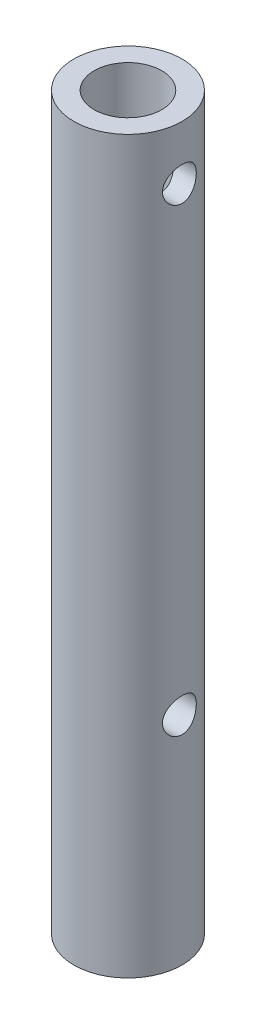
ISO-10303-21;
HEADER;
FILE_DESCRIPTION(('STEP AP214'),'2;1');
FILE_NAME('part.step','',(''),(''),'','','');
FILE_SCHEMA(('AUTOMOTIVE_DESIGN { 1 0 10303 214 1 1 1 1 }'));
ENDSEC;
DATA;
#1=APPLICATION_CONTEXT('core data for automotive mechanical design processes');
#2=APPLICATION_PROTOCOL_DEFINITION('international standard','automotive_design',2000,#1);
#3=PRODUCT_CONTEXT('',#1,'mechanical');
#4=PRODUCT('Part','Part','',(#3));
#5=PRODUCT_RELATED_PRODUCT_CATEGORY('part','',(#4));
#6=PRODUCT_DEFINITION_FORMATION('','',#4);
#7=PRODUCT_DEFINITION_CONTEXT('part definition',#1,'design');
#8=PRODUCT_DEFINITION('design','',#6,#7);
#9=PRODUCT_DEFINITION_SHAPE('','',#8);
#10=(LENGTH_UNIT() NAMED_UNIT(*) SI_UNIT(.MILLI.,.METRE.));
#11=(NAMED_UNIT(*) PLANE_ANGLE_UNIT() SI_UNIT($,.RADIAN.));
#12=(NAMED_UNIT(*) SI_UNIT($,.STERADIAN.) SOLID_ANGLE_UNIT());
#13=UNCERTAINTY_MEASURE_WITH_UNIT(LENGTH_MEASURE(1.E-05),#10,'distance_accuracy_value','');
#14=(GEOMETRIC_REPRESENTATION_CONTEXT(3) GLOBAL_UNCERTAINTY_ASSIGNED_CONTEXT((#13)) GLOBAL_UNIT_ASSIGNED_CONTEXT((#10,
#11,#12)) REPRESENTATION_CONTEXT('',''));
#15=CARTESIAN_POINT('',(0.,0.,0.));
#16=DIRECTION('',(0.,0.,1.));
#17=DIRECTION('',(1.,0.,0.));
#18=AXIS2_PLACEMENT_3D('',#15,#16,#17);
#19=CARTESIAN_POINT('',(0.,54.,0.));
#20=DIRECTION('',(0.,-1.,0.));
#21=DIRECTION('',(0.,0.,-1.));
#22=AXIS2_PLACEMENT_3D('',#19,#20,#21);
#23=CYLINDRICAL_SURFACE('',#22,4.);
#24=CARTESIAN_POINT('',(-4.,14.75,0.));
#25=CARTESIAN_POINT('',(-3.99999965877989,14.7500004465876,-0.0684391851745461));
#26=CARTESIAN_POINT('',(-3.99822694984841,14.7556392269445,-0.136883052502858));
#27=CARTESIAN_POINT('',(-3.99132894088807,14.7779862415392,-0.271769209588447));
#28=CARTESIAN_POINT('',(-3.9862028819986,14.7946969813644,-0.338211042725905));
#29=CARTESIAN_POINT('',(-3.97315815697909,14.8385693711957,-0.467128543650804));
#30=CARTESIAN_POINT('',(-3.96524381499025,14.865714844653,-0.5296101769858));
#31=CARTESIAN_POINT('',(-3.94743969161093,14.9296173176783,-0.649134802346455));
#32=CARTESIAN_POINT('',(-3.93754959899905,14.9663758317806,-0.70617693544488));
#33=CARTESIAN_POINT('',(-3.91650213740283,15.0496559920174,-0.814965334952276));
#34=CARTESIAN_POINT('',(-3.90531715926989,15.0964208850611,-0.866520028156654));
#35=CARTESIAN_POINT('',(-3.88310046374209,15.1978683924136,-0.961197382036987));
#36=CARTESIAN_POINT('',(-3.87206877523457,15.2525524774946,-1.00431847289869));
#37=CARTESIAN_POINT('',(-3.85111144698172,15.3699445638081,-1.08194336483113));
#38=CARTESIAN_POINT('',(-3.84121988301796,15.4328174775272,-1.11620784150128));
#39=CARTESIAN_POINT('',(-3.82407801799235,15.5637923149819,-1.17359741076671));
#40=CARTESIAN_POINT('',(-3.81682702128689,15.6318928557939,-1.19672543771944));
#41=CARTESIAN_POINT('',(-3.80607606984501,15.7692280774521,-1.23048459930033));
#42=CARTESIAN_POINT('',(-3.80246972929509,15.8383668436389,-1.24147110007864));
#43=CARTESIAN_POINT('',(-3.79910055140951,15.9775931189119,-1.25174555036987));
#44=CARTESIAN_POINT('',(-3.79933669227334,16.0476803708217,-1.25103660995771));
#45=CARTESIAN_POINT('',(-3.80353189075438,16.183874460269,-1.23821824732739));
#46=CARTESIAN_POINT('',(-3.80734341745949,16.2500291258616,-1.22656057869382));
#47=CARTESIAN_POINT('',(-3.81802025652489,16.3793921565373,-1.19290813355625));
#48=CARTESIAN_POINT('',(-3.82488589343115,16.4426002077088,-1.1709122584455));
#49=CARTESIAN_POINT('',(-3.84101044014297,16.5653519444326,-1.11688874681276));
#50=CARTESIAN_POINT('',(-3.85030284660825,16.624828610692,-1.08471925662081));
#51=CARTESIAN_POINT('',(-3.8702185658007,16.7376877678791,-1.01136020737847));
#52=CARTESIAN_POINT('',(-3.88084222394551,16.7910686702537,-0.970168305215766));
#53=CARTESIAN_POINT('',(-3.90281527800493,16.892774943417,-0.877716954182118));
#54=CARTESIAN_POINT('',(-3.91417569605696,16.9407595577797,-0.826084570592812));
#55=CARTESIAN_POINT('',(-3.9359157075958,17.0274718935797,-0.715364408095527));
#56=CARTESIAN_POINT('',(-3.94629522838372,17.0661989292192,-0.656276077349017));
#57=CARTESIAN_POINT('',(-3.96501294890191,17.1335276886013,-0.531664610465451));
#58=CARTESIAN_POINT('',(-3.97333460648208,17.162048135464,-0.466094906919277));
#59=CARTESIAN_POINT('',(-3.98687955828554,17.2075530008516,-0.330767977782643));
#60=CARTESIAN_POINT('',(-3.99210379325151,17.2245409222384,-0.261012030724607));
#61=CARTESIAN_POINT('',(-3.99871389395014,17.245918042579,-0.122185157290343));
#62=CARTESIAN_POINT('',(-4.00024022895439,17.2507685435935,-0.0531918487888408));
#63=CARTESIAN_POINT('',(-3.99969799730981,17.2490337733627,0.0846303057325853));
#64=CARTESIAN_POINT('',(-3.99762995581125,17.2424501726774,0.153459174306505));
#65=CARTESIAN_POINT('',(-3.99022363769772,17.2184044073936,0.287219332975851));
#66=CARTESIAN_POINT('',(-3.98496793110725,17.2012167323875,0.352204978420948));
#67=CARTESIAN_POINT('',(-3.97180121379252,17.1567856476333,0.478351928861364));
#68=CARTESIAN_POINT('',(-3.96388987514204,17.1295409959751,0.539512760449014));
#69=CARTESIAN_POINT('',(-3.94598542759568,17.0650267834512,0.657932406672229));
#70=CARTESIAN_POINT('',(-3.9359462681821,17.0275290125028,0.715059739787953));
#71=CARTESIAN_POINT('',(-3.91493410002887,16.943846789883,0.822365850960093));
#72=CARTESIAN_POINT('',(-3.90396083845862,16.8976599822569,0.872542738043332));
#73=CARTESIAN_POINT('',(-3.88176994885247,16.7957411099463,0.966587462919652));
#74=CARTESIAN_POINT('',(-3.87055986714446,16.7397033362547,1.01012652339773));
#75=CARTESIAN_POINT('',(-3.84961947087602,16.6208733836293,1.08721250244908));
#76=CARTESIAN_POINT('',(-3.839889132814,16.5580813119956,1.12075957972523));
#77=CARTESIAN_POINT('',(-3.82311782360754,16.4276548271141,1.1767008348114));
#78=CARTESIAN_POINT('',(-3.81606646468027,16.3600403504953,1.19913819558885));
#79=CARTESIAN_POINT('',(-3.80551170941212,16.2217275066762,1.23222894320963));
#80=CARTESIAN_POINT('',(-3.80200696302675,16.1510303236287,1.24288681414609));
#81=CARTESIAN_POINT('',(-3.79908292712495,16.0119959124458,1.2517940615754));
#82=CARTESIAN_POINT('',(-3.79948604683077,15.9436965461871,1.25058279621956));
#83=CARTESIAN_POINT('',(-3.80390090472383,15.8083254150808,1.23708818129473));
#84=CARTESIAN_POINT('',(-3.80791247457319,15.741253593116,1.22480534822558));
#85=CARTESIAN_POINT('',(-3.81896814158112,15.6112059603982,1.18987729913377));
#86=CARTESIAN_POINT('',(-3.82596698183475,15.548184558904,1.16738642405943));
#87=CARTESIAN_POINT('',(-3.84219704261348,15.4267595864687,1.11280227335063));
#88=CARTESIAN_POINT('',(-3.85142871716522,15.3683569579223,1.08070704444254));
#89=CARTESIAN_POINT('',(-3.8715348703158,15.2553540295594,1.00635675013474));
#90=CARTESIAN_POINT('',(-3.88245948922441,15.2009918704996,0.963753335241267));
#91=CARTESIAN_POINT('',(-3.90448998821726,15.1000136718882,0.870208996404841));
#92=CARTESIAN_POINT('',(-3.91559591606795,15.053399711009,0.819265842344396));
#93=CARTESIAN_POINT('',(-3.93717271952329,14.967717461637,0.708486662823326));
#94=CARTESIAN_POINT('',(-3.94761101730634,14.92894526355,0.648414574487374));
#95=CARTESIAN_POINT('',(-3.96626769296917,14.8621010848606,0.522279138013649));
#96=CARTESIAN_POINT('',(-3.97448694315832,14.8340248978582,0.456218157795445));
#97=CARTESIAN_POINT('',(-3.98720650733461,14.7914086323915,0.325747635373974));
#98=CARTESIAN_POINT('',(-3.99196240806139,14.7759251326947,0.261670337112543));
#99=CARTESIAN_POINT('',(-3.99835900340486,14.7552216400323,0.131729895440246));
#100=CARTESIAN_POINT('',(-4.00000032839644,14.749999570196,0.0658671161396741));
#101=CARTESIAN_POINT('',(-4.,14.75,0.));
#102=B_SPLINE_CURVE_WITH_KNOTS('',3,(#24,#25,#26,#27,#28,#29,#30,#31,#32,#33,#34,#35,#36,#37,
#38,#39,#40,#41,#42,#43,#44,#45,#46,#47,#48,#49,#50,#51,#52,#53,#54,#55,#56,#57,#58,#59,#60,#61,
#62,#63,#64,#65,#66,#67,#68,#69,#70,#71,#72,#73,#74,#75,#76,#77,#78,#79,#80,#81,#82,#83,#84,#85,
#86,#87,#88,#89,#90,#91,#92,#93,#94,#95,#96,#97,#98,#99,#100,#101),.UNSPECIFIED.,.T.,.F.,(4,2,2,
2,2,2,2,2,2,2,2,2,2,2,2,2,2,2,2,2,2,2,2,2,2,2,2,2,2,2,2,2,2,2,2,2,2,2,4),(0.,0.205075449432509,
0.410197323349064,0.615002479202432,0.819839921558386,1.03037822195158,1.24095567431275,
1.45673771247493,1.67246286279526,1.88169150167208,2.09086450295137,2.29176917422168,
2.49269519979061,2.69655642720544,2.90047066010357,3.11366747279598,3.32688007413301,
3.54175460689768,3.75656384494552,3.96307568548235,4.1695573564936,4.37090626722869,
4.57228005034497,4.7785632473834,4.98490245709257,5.19941778713137,5.41392970983709,
5.62760115751028,5.84119123892427,6.0451220347605,6.24904331751081,6.44997913396668,
6.6509558433017,6.85979514006358,7.06869037373337,7.28440668126408,7.50003806666333,
7.69744636651536,7.89481470763043),.UNSPECIFIED.);
#103=CARTESIAN_POINT('',(-4.,14.75,0.));
#104=VERTEX_POINT('',#103);
#105=EDGE_CURVE('E11',#104,#104,#102,.T.);
#106=ORIENTED_EDGE('',*,*,#105,.T.);
#107=EDGE_LOOP('',(#106));
#108=FACE_BOUND('',#107,.T.);
#109=CARTESIAN_POINT('',(4.,14.75,0.));
#110=CARTESIAN_POINT('',(3.99999965877989,14.7500004465876,0.0684391851745461));
#111=CARTESIAN_POINT('',(3.99822694984841,14.7556392269445,0.136883052502858));
#112=CARTESIAN_POINT('',(3.99132894088807,14.7779862415392,0.271769209588447));
#113=CARTESIAN_POINT('',(3.9862028819986,14.7946969813644,0.338211042725905));
#114=CARTESIAN_POINT('',(3.97315815697909,14.8385693711957,0.467128543650804));
#115=CARTESIAN_POINT('',(3.96524381499025,14.865714844653,0.5296101769858));
#116=CARTESIAN_POINT('',(3.94743969161093,14.9296173176783,0.649134802346455));
#117=CARTESIAN_POINT('',(3.93754959899905,14.9663758317806,0.70617693544488));
#118=CARTESIAN_POINT('',(3.91650213740283,15.0496559920174,0.814965334952276));
#119=CARTESIAN_POINT('',(3.90531715926989,15.0964208850611,0.866520028156654));
#120=CARTESIAN_POINT('',(3.88310046374209,15.1978683924136,0.961197382036987));
#121=CARTESIAN_POINT('',(3.87206877523457,15.2525524774946,1.00431847289869));
#122=CARTESIAN_POINT('',(3.85111144698172,15.3699445638081,1.08194336483113));
#123=CARTESIAN_POINT('',(3.84121988301796,15.4328174775272,1.11620784150128));
#124=CARTESIAN_POINT('',(3.82407801799235,15.5637923149819,1.17359741076671));
#125=CARTESIAN_POINT('',(3.81682702128689,15.6318928557939,1.19672543771944));
#126=CARTESIAN_POINT('',(3.80607606984501,15.7692280774521,1.23048459930033));
#127=CARTESIAN_POINT('',(3.80246972929509,15.8383668436389,1.24147110007864));
#128=CARTESIAN_POINT('',(3.79910055140951,15.9775931189119,1.25174555036987));
#129=CARTESIAN_POINT('',(3.79933669227334,16.0476803708217,1.25103660995771));
#130=CARTESIAN_POINT('',(3.80353189075438,16.183874460269,1.23821824732739));
#131=CARTESIAN_POINT('',(3.80734341745949,16.2500291258616,1.22656057869382));
#132=CARTESIAN_POINT('',(3.81802025652489,16.3793921565373,1.19290813355625));
#133=CARTESIAN_POINT('',(3.82488589343115,16.4426002077088,1.1709122584455));
#134=CARTESIAN_POINT('',(3.84101044014297,16.5653519444326,1.11688874681276));
#135=CARTESIAN_POINT('',(3.85030284660825,16.624828610692,1.08471925662081));
#136=CARTESIAN_POINT('',(3.8702185658007,16.7376877678791,1.01136020737847));
#137=CARTESIAN_POINT('',(3.88084222394551,16.7910686702537,0.970168305215766));
#138=CARTESIAN_POINT('',(3.90281527800493,16.892774943417,0.877716954182118));
#139=CARTESIAN_POINT('',(3.91417569605696,16.9407595577797,0.826084570592812));
#140=CARTESIAN_POINT('',(3.9359157075958,17.0274718935797,0.715364408095527));
#141=CARTESIAN_POINT('',(3.94629522838372,17.0661989292192,0.656276077349017));
#142=CARTESIAN_POINT('',(3.96501294890191,17.1335276886013,0.531664610465451));
#143=CARTESIAN_POINT('',(3.97333460648208,17.162048135464,0.466094906919277));
#144=CARTESIAN_POINT('',(3.98687955828554,17.2075530008516,0.330767977782643));
#145=CARTESIAN_POINT('',(3.99210379325151,17.2245409222384,0.261012030724607));
#146=CARTESIAN_POINT('',(3.99871389395014,17.245918042579,0.122185157290343));
#147=CARTESIAN_POINT('',(4.00024022895439,17.2507685435935,0.0531918487888408));
#148=CARTESIAN_POINT('',(3.99969799730981,17.2490337733627,-0.0846303057325853));
#149=CARTESIAN_POINT('',(3.99762995581125,17.2424501726774,-0.153459174306505));
#150=CARTESIAN_POINT('',(3.99022363769772,17.2184044073936,-0.287219332975851));
#151=CARTESIAN_POINT('',(3.98496793110725,17.2012167323875,-0.352204978420948));
#152=CARTESIAN_POINT('',(3.97180121379252,17.1567856476333,-0.478351928861364));
#153=CARTESIAN_POINT('',(3.96388987514204,17.1295409959751,-0.539512760449014));
#154=CARTESIAN_POINT('',(3.94598542759568,17.0650267834512,-0.657932406672229));
#155=CARTESIAN_POINT('',(3.9359462681821,17.0275290125028,-0.715059739787953));
#156=CARTESIAN_POINT('',(3.91493410002887,16.943846789883,-0.822365850960093));
#157=CARTESIAN_POINT('',(3.90396083845862,16.8976599822569,-0.872542738043332));
#158=CARTESIAN_POINT('',(3.88176994885247,16.7957411099463,-0.966587462919652));
#159=CARTESIAN_POINT('',(3.87055986714446,16.7397033362547,-1.01012652339773));
#160=CARTESIAN_POINT('',(3.84961947087602,16.6208733836293,-1.08721250244908));
#161=CARTESIAN_POINT('',(3.839889132814,16.5580813119956,-1.12075957972523));
#162=CARTESIAN_POINT('',(3.82311782360754,16.4276548271141,-1.1767008348114));
#163=CARTESIAN_POINT('',(3.81606646468027,16.3600403504953,-1.19913819558885));
#164=CARTESIAN_POINT('',(3.80551170941212,16.2217275066762,-1.23222894320963));
#165=CARTESIAN_POINT('',(3.80200696302675,16.1510303236287,-1.24288681414609));
#166=CARTESIAN_POINT('',(3.79908292712495,16.0119959124458,-1.2517940615754));
#167=CARTESIAN_POINT('',(3.79948604683077,15.9436965461871,-1.25058279621956));
#168=CARTESIAN_POINT('',(3.80390090472383,15.8083254150808,-1.23708818129473));
#169=CARTESIAN_POINT('',(3.80791247457319,15.741253593116,-1.22480534822558));
#170=CARTESIAN_POINT('',(3.81896814158112,15.6112059603982,-1.18987729913377));
#171=CARTESIAN_POINT('',(3.82596698183475,15.548184558904,-1.16738642405943));
#172=CARTESIAN_POINT('',(3.84219704261348,15.4267595864687,-1.11280227335063));
#173=CARTESIAN_POINT('',(3.85142871716522,15.3683569579223,-1.08070704444254));
#174=CARTESIAN_POINT('',(3.8715348703158,15.2553540295594,-1.00635675013474));
#175=CARTESIAN_POINT('',(3.88245948922441,15.2009918704996,-0.963753335241267));
#176=CARTESIAN_POINT('',(3.90448998821726,15.1000136718882,-0.870208996404841));
#177=CARTESIAN_POINT('',(3.91559591606795,15.053399711009,-0.819265842344396));
#178=CARTESIAN_POINT('',(3.93717271952329,14.967717461637,-0.708486662823326));
#179=CARTESIAN_POINT('',(3.94761101730634,14.92894526355,-0.648414574487374));
#180=CARTESIAN_POINT('',(3.96626769296917,14.8621010848606,-0.522279138013649));
#181=CARTESIAN_POINT('',(3.97448694315832,14.8340248978582,-0.456218157795445));
#182=CARTESIAN_POINT('',(3.98720650733461,14.7914086323915,-0.325747635373974));
#183=CARTESIAN_POINT('',(3.99196240806139,14.7759251326947,-0.261670337112543));
#184=CARTESIAN_POINT('',(3.99835900340486,14.7552216400323,-0.131729895440246));
#185=CARTESIAN_POINT('',(4.00000032839644,14.749999570196,-0.0658671161396741));
#186=CARTESIAN_POINT('',(4.,14.75,0.));
#187=B_SPLINE_CURVE_WITH_KNOTS('',3,(#109,#110,#111,#112,#113,#114,#115,#116,#117,#118,#119,
#120,#121,#122,#123,#124,#125,#126,#127,#128,#129,#130,#131,#132,#133,#134,#135,#136,#137,#138,
#139,#140,#141,#142,#143,#144,#145,#146,#147,#148,#149,#150,#151,#152,#153,#154,#155,#156,#157,
#158,#159,#160,#161,#162,#163,#164,#165,#166,#167,#168,#169,#170,#171,#172,#173,#174,#175,#176,
#177,#178,#179,#180,#181,#182,#183,#184,#185,#186),.UNSPECIFIED.,.T.,.F.,(4,2,2,2,2,2,2,2,2,2,2,
2,2,2,2,2,2,2,2,2,2,2,2,2,2,2,2,2,2,2,2,2,2,2,2,2,2,2,4),(0.,0.205075449432509,
0.410197323349064,0.615002479202432,0.819839921558386,1.03037822195158,1.24095567431275,
1.45673771247493,1.67246286279526,1.88169150167208,2.09086450295137,2.29176917422168,
2.49269519979061,2.69655642720544,2.90047066010357,3.11366747279598,3.32688007413301,
3.54175460689768,3.75656384494552,3.96307568548235,4.1695573564936,4.37090626722869,
4.57228005034497,4.7785632473834,4.98490245709257,5.19941778713137,5.41392970983709,
5.62760115751028,5.84119123892427,6.0451220347605,6.24904331751081,6.44997913396668,
6.6509558433017,6.85979514006358,7.06869037373337,7.28440668126408,7.50003806666333,
7.69744636651536,7.89481470763043),.UNSPECIFIED.);
#188=CARTESIAN_POINT('',(4.,14.75,0.));
#189=VERTEX_POINT('',#188);
#190=EDGE_CURVE('E49',#189,#189,#187,.T.);
#191=ORIENTED_EDGE('',*,*,#190,.T.);
#192=EDGE_LOOP('',(#191));
#193=FACE_BOUND('',#192,.T.);
#194=CARTESIAN_POINT('',(3.79967103839267,50.,1.24999999999999));
#195=CARTESIAN_POINT('',(3.79967145961936,50.0683470361093,1.24999953780046));
#196=CARTESIAN_POINT('',(3.80153531505043,50.1366987687032,1.24437538791493));
#197=CARTESIAN_POINT('',(3.80875638998877,50.2713941608778,1.22209175401326));
#198=CARTESIAN_POINT('',(3.81411455353136,50.3377372727322,1.20542928782514));
#199=CARTESIAN_POINT('',(3.8276593883596,50.466444901932,1.16169788223558));
#200=CARTESIAN_POINT('',(3.83584105194317,50.5288162331057,1.13464735736676));
#201=CARTESIAN_POINT('',(3.85410406218689,50.648152695864,1.07096914173156));
#202=CARTESIAN_POINT('',(3.86418574435841,50.7051168699601,1.03433975905631));
#203=CARTESIAN_POINT('',(3.8855012766862,50.8139788674935,0.951196070622285));
#204=CARTESIAN_POINT('',(3.89676123384781,50.865663609436,0.904409399720392));
#205=CARTESIAN_POINT('',(3.91894245860336,50.9605960132092,0.80286204645549));
#206=CARTESIAN_POINT('',(3.92986367872627,51.0038424969448,0.748100252518561));
#207=CARTESIAN_POINT('',(3.95043553390078,51.0816110630112,0.630625912493361));
#208=CARTESIAN_POINT('',(3.9600518456278,51.1159137038314,0.567761556520095));
#209=CARTESIAN_POINT('',(3.97662551833019,51.1733760498555,0.436804232853404));
#210=CARTESIAN_POINT('',(3.98358350419919,51.1965383741496,0.36871249848705));
#211=CARTESIAN_POINT('',(3.99387175820863,51.2303511280971,0.231464356966095));
#212=CARTESIAN_POINT('',(3.99730738984143,51.2413657497878,0.162405715468214));
#213=CARTESIAN_POINT('',(4.00053595876015,51.2517243464375,0.0233408139845213));
#214=CARTESIAN_POINT('',(4.00032972410065,51.2510709743588,-0.0466652269730819));
#215=CARTESIAN_POINT('',(3.99637116132537,51.238351708414,-0.183074480354731));
#216=CARTESIAN_POINT('',(3.99274150972157,51.226680616487,-0.249518634314039));
#217=CARTESIAN_POINT('',(3.98249482560855,51.192905009957,-0.379453063347764));
#218=CARTESIAN_POINT('',(3.97587759827134,51.1707998149134,-0.44294314548119));
#219=CARTESIAN_POINT('',(3.96023459729533,51.1165298109251,-0.566078103154774));
#220=CARTESIAN_POINT('',(3.95118033616957,51.084245191437,-0.625666405622822));
#221=CARTESIAN_POINT('',(3.93161722953562,51.0106289002954,-0.73870251115202));
#222=CARTESIAN_POINT('',(3.92110801644585,50.9692949408622,-0.792148756208829));
#223=CARTESIAN_POINT('',(3.89923670734647,50.8767263651987,-0.893737698453873));
#224=CARTESIAN_POINT('',(3.88785731989084,50.8251509311588,-0.941566549094172));
#225=CARTESIAN_POINT('',(3.86590615440413,50.7146048981755,-1.02798974259537));
#226=CARTESIAN_POINT('',(3.85533447159847,50.655633429425,-1.0665829977534));
#227=CARTESIAN_POINT('',(3.83610846648974,50.5310825311402,-1.13380465019764));
#228=CARTESIAN_POINT('',(3.82747690354324,50.4654365909576,-1.16231680702681));
#229=CARTESIAN_POINT('',(3.81337545338914,50.3299405081046,-1.20778345948512));
#230=CARTESIAN_POINT('',(3.80790443033294,50.2600918857895,-1.22474210765792));
#231=CARTESIAN_POINT('',(3.80099563391873,50.1211800474342,-1.24601485185707));
#232=CARTESIAN_POINT('',(3.79940466389696,50.0521980037679,-1.25080954353709));
#233=CARTESIAN_POINT('',(3.80001077463985,49.9144102585018,-1.24896744498306));
#234=CARTESIAN_POINT('',(3.8022072700839,49.8456045312995,-1.24233242111455));
#235=CARTESIAN_POINT('',(3.80998957482875,49.7121917033484,-1.21824873513142));
#236=CARTESIAN_POINT('',(3.81547554101732,49.647520725926,-1.20111831160537));
#237=CARTESIAN_POINT('',(3.82911287331661,49.521978208004,-1.15690373661027));
#238=CARTESIAN_POINT('',(3.83726467412388,49.4611072890788,-1.12981796171154));
#239=CARTESIAN_POINT('',(3.85560539653156,49.3429608902283,-1.06557510655874));
#240=CARTESIAN_POINT('',(3.86584603489733,49.2858385844072,-1.02815147488557));
#241=CARTESIAN_POINT('',(3.88710348972829,49.1785096536381,-0.944606408679805));
#242=CARTESIAN_POINT('',(3.89812050735703,49.1283048310747,-0.898482714690777));
#243=CARTESIAN_POINT('',(3.92024187562679,49.0340896340872,-0.796572947753597));
#244=CARTESIAN_POINT('',(3.9313309228568,48.9904222138601,-0.740465649788514));
#245=CARTESIAN_POINT('',(3.95189059843678,48.9131089566788,-0.621451545651391));
#246=CARTESIAN_POINT('',(3.96136130090946,48.879462660689,-0.558545051108616));
#247=CARTESIAN_POINT('',(3.97756311928512,48.8234694375283,-0.428105523331826));
#248=CARTESIAN_POINT('',(3.984313995612,48.8010407121563,-0.360610184283752));
#249=CARTESIAN_POINT('',(3.99440242648576,48.7679274614103,-0.222557254056389));
#250=CARTESIAN_POINT('',(3.99774104914277,48.7572392609165,-0.152000628340357));
#251=CARTESIAN_POINT('',(4.00055803404462,48.7482089982504,-0.0129849366489015));
#252=CARTESIAN_POINT('',(4.0001912940739,48.7493715498293,0.0554391919465191));
#253=CARTESIAN_POINT('',(3.99600978081049,48.7628118110487,0.191073221923244));
#254=CARTESIAN_POINT('',(3.99219523232619,48.775088795992,0.258283202179564));
#255=CARTESIAN_POINT('',(3.98159570844796,48.8100940092223,0.388755118480786));
#256=CARTESIAN_POINT('',(3.97484847960205,48.8326896078454,0.452055918449476));
#257=CARTESIAN_POINT('',(3.9590794558795,48.8875708272085,0.573998425500084));
#258=CARTESIAN_POINT('',(3.95005727091358,48.9198581099734,0.632639331274474));
#259=CARTESIAN_POINT('',(3.93029896883376,48.9944727583445,0.74576169496968));
#260=CARTESIAN_POINT('',(3.91951509750962,49.037103522464,0.800034607053103));
#261=CARTESIAN_POINT('',(3.89758736547061,49.1306598894435,0.900820791399309));
#262=CARTESIAN_POINT('',(3.88644339784827,49.1815879741394,0.947331733504149));
#263=CARTESIAN_POINT('',(3.86461892577438,49.2923157198411,1.03282865911251));
#264=CARTESIAN_POINT('',(3.85396600863456,49.3523534031166,1.0715142799471));
#265=CARTESIAN_POINT('',(3.83480125279531,49.4783981202691,1.1382047074852));
#266=CARTESIAN_POINT('',(3.82628854861387,49.5444027264503,1.16621383403545));
#267=CARTESIAN_POINT('',(3.81306560440328,49.6747226173147,1.20871180435791));
#268=CARTESIAN_POINT('',(3.80809315043749,49.7387025474516,1.22414939837872));
#269=CARTESIAN_POINT('',(3.80139606482399,49.8684538320965,1.24479245816098));
#270=CARTESIAN_POINT('',(3.79967063301599,49.9342247412015,1.25000044480777));
#271=CARTESIAN_POINT('',(3.79967103839267,50.,1.24999999999999));
#272=B_SPLINE_CURVE_WITH_KNOTS('',3,(#194,#195,#196,#197,#198,#199,#200,#201,#202,#203,#204,
#205,#206,#207,#208,#209,#210,#211,#212,#213,#214,#215,#216,#217,#218,#219,#220,#221,#222,#223,
#224,#225,#226,#227,#228,#229,#230,#231,#232,#233,#234,#235,#236,#237,#238,#239,#240,#241,#242,
#243,#244,#245,#246,#247,#248,#249,#250,#251,#252,#253,#254,#255,#256,#257,#258,#259,#260,#261,
#262,#263,#264,#265,#266,#267,#268,#269,#270,#271),.UNSPECIFIED.,.T.,.F.,(4,2,2,2,2,2,2,2,2,2,2,
2,2,2,2,2,2,2,2,2,2,2,2,2,2,2,2,2,2,2,2,2,2,2,2,2,2,2,4),(0.,0.204798137548494,
0.409651627059729,0.614143644118571,0.818671804924937,1.02957080550837,1.24049922941121,
1.45619821963731,1.6718464741792,1.88083722835532,2.08978046471772,2.29150982969748,
2.4932523519009,2.69746404608406,2.90172742713185,3.11450338937331,3.32730439853772,
3.5424847093445,3.75758763952748,3.96404933287931,4.17047912219085,4.37093972044358,
4.57143302253205,4.77767613309605,4.98397288011875,5.19881937811506,5.41365603317081,
5.62690239290992,5.84008198140579,6.04438802439519,6.248680746923,6.45041846514753,
6.65219079911645,6.86080693105208,7.06948557772183,7.28507795501697,7.50058300803815,
7.69772354371378,7.89481549188771),.UNSPECIFIED.);
#273=CARTESIAN_POINT('',(3.79967103839267,50.,1.24999999999999));
#274=VERTEX_POINT('',#273);
#275=EDGE_CURVE('E69',#274,#274,#272,.T.);
#276=ORIENTED_EDGE('',*,*,#275,.T.);
#277=EDGE_LOOP('',(#276));
#278=FACE_BOUND('',#277,.T.);
#279=CARTESIAN_POINT('',(0.,54.,0.));
#280=DIRECTION('',(0.,1.,0.));
#281=DIRECTION('',(0.,0.,1.));
#282=AXIS2_PLACEMENT_3D('',#279,#280,#281);
#283=CIRCLE('',#282,4.);
#284=CARTESIAN_POINT('',(0.,54.,4.));
#285=VERTEX_POINT('',#284);
#286=EDGE_CURVE('E66',#285,#285,#283,.T.);
#287=ORIENTED_EDGE('',*,*,#286,.F.);
#288=EDGE_LOOP('',(#287));
#289=FACE_BOUND('',#288,.T.);
#290=CARTESIAN_POINT('',(0.,0.,0.));
#291=DIRECTION('',(0.,1.,0.));
#292=DIRECTION('',(0.,0.,1.));
#293=AXIS2_PLACEMENT_3D('',#290,#291,#292);
#294=CIRCLE('',#293,4.);
#295=CARTESIAN_POINT('',(0.,0.,4.));
#296=VERTEX_POINT('',#295);
#297=EDGE_CURVE('E62',#296,#296,#294,.T.);
#298=ORIENTED_EDGE('',*,*,#297,.T.);
#299=EDGE_LOOP('',(#298));
#300=FACE_BOUND('',#299,.T.);
#301=ADVANCED_FACE('F38',(#108,#193,#278,#289,#300),#23,.T.);
#302=CARTESIAN_POINT('',(0.,54.,0.));
#303=DIRECTION('',(0.,1.,0.));
#304=DIRECTION('',(0.,0.,1.));
#305=AXIS2_PLACEMENT_3D('',#302,#303,#304);
#306=PLANE('',#305);
#307=CARTESIAN_POINT('',(0.,54.,0.));
#308=DIRECTION('',(0.,1.,0.));
#309=DIRECTION('',(0.,0.,1.));
#310=AXIS2_PLACEMENT_3D('',#307,#308,#309);
#311=CIRCLE('',#310,2.5);
#312=CARTESIAN_POINT('',(0.,54.,2.5));
#313=VERTEX_POINT('',#312);
#314=EDGE_CURVE('E63',#313,#313,#311,.T.);
#315=ORIENTED_EDGE('',*,*,#314,.F.);
#316=EDGE_LOOP('',(#315));
#317=FACE_BOUND('',#316,.T.);
#318=ORIENTED_EDGE('',*,*,#286,.T.);
#319=EDGE_LOOP('',(#318));
#320=FACE_BOUND('',#319,.T.);
#321=ADVANCED_FACE('F103',(#317,#320),#306,.T.);
#322=CARTESIAN_POINT('',(0.,0.,0.));
#323=DIRECTION('',(0.,1.,0.));
#324=DIRECTION('',(0.,0.,1.));
#325=AXIS2_PLACEMENT_3D('',#322,#323,#324);
#326=PLANE('',#325);
#327=ORIENTED_EDGE('',*,*,#297,.F.);
#328=EDGE_LOOP('',(#327));
#329=FACE_BOUND('',#328,.T.);
#330=ADVANCED_FACE('F56',(#329),#326,.F.);
#331=CARTESIAN_POINT('',(0.,34.,0.));
#332=DIRECTION('',(0.,1.,0.));
#333=DIRECTION('',(0.,0.,1.));
#334=AXIS2_PLACEMENT_3D('',#331,#332,#333);
#335=CONICAL_SURFACE('',#334,2.5,1.02974425867665);
#336=CARTESIAN_POINT('',(0.,32.4978484524311,0.));
#337=VERTEX_POINT('',#336);
#338=VERTEX_LOOP('',#337);
#339=FACE_BOUND('',#338,.T.);
#340=CARTESIAN_POINT('',(0.,34.,0.));
#341=DIRECTION('',(0.,1.,0.));
#342=DIRECTION('',(0.,0.,1.));
#343=AXIS2_PLACEMENT_3D('',#340,#341,#342);
#344=CIRCLE('',#343,2.5);
#345=CARTESIAN_POINT('',(0.,34.,2.5));
#346=VERTEX_POINT('',#345);
#347=EDGE_CURVE('E60',#346,#346,#344,.T.);
#348=ORIENTED_EDGE('',*,*,#347,.T.);
#349=EDGE_LOOP('',(#348));
#350=FACE_BOUND('',#349,.T.);
#351=ADVANCED_FACE('F52',(#339,#350),#335,.F.);
#352=CARTESIAN_POINT('',(0.,54.,0.));
#353=DIRECTION('',(0.,1.,0.));
#354=DIRECTION('',(0.,0.,1.));
#355=AXIS2_PLACEMENT_3D('',#352,#353,#354);
#356=CYLINDRICAL_SURFACE('',#355,2.5);
#357=CARTESIAN_POINT('',(2.1650635094611,50.,1.24999999999999));
#358=CARTESIAN_POINT('',(2.16506918410574,49.9348652397559,1.24999545384315));
#359=CARTESIAN_POINT('',(2.16804751484696,49.8696482355937,1.24487496341651));
#360=CARTESIAN_POINT('',(2.17952958065066,49.7412159191536,1.22465401237255));
#361=CARTESIAN_POINT('',(2.1880449256945,49.6780051061957,1.20953258069271));
#362=CARTESIAN_POINT('',(2.20936683256748,49.5556854195701,1.17012493587475));
#363=CARTESIAN_POINT('',(2.22215054341565,49.496556684408,1.14588744061715));
#364=CARTESIAN_POINT('',(2.25053331021073,49.3832197475041,1.08908440672045));
#365=CARTESIAN_POINT('',(2.26613251845081,49.3290118121719,1.0565184175447));
#366=CARTESIAN_POINT('',(2.29996086321802,49.2221178393031,0.980833175663586));
#367=CARTESIAN_POINT('',(2.31830079547442,49.1699260804081,0.937065045179699));
#368=CARTESIAN_POINT('',(2.35464978482132,49.0732395144916,0.841567259518072));
#369=CARTESIAN_POINT('',(2.37265867289063,49.0287485467706,0.789833657227855));
#370=CARTESIAN_POINT('',(2.40776846191186,48.9457910610654,0.675611954268174));
#371=CARTESIAN_POINT('',(2.42472633022716,48.9079327901756,0.61263398626571));
#372=CARTESIAN_POINT('',(2.45438445124411,48.8435739334428,0.480196283249373));
#373=CARTESIAN_POINT('',(2.46708738979677,48.8170661798285,0.41074067267269));
#374=CARTESIAN_POINT('',(2.48600576555297,48.7781191733736,0.272556179907469));
#375=CARTESIAN_POINT('',(2.49261850276115,48.7648130920556,0.204127238111019));
#376=CARTESIAN_POINT('',(2.50009479807584,48.7497923516562,0.0657132858723074));
#377=CARTESIAN_POINT('',(2.50096183480737,48.7480706790054,-0.00427075730467565));
#378=CARTESIAN_POINT('',(2.49703727395562,48.755933342463,-0.13729065552969));
#379=CARTESIAN_POINT('',(2.492731198652,48.7645475194015,-0.200401498970992));
#380=CARTESIAN_POINT('',(2.47967806574684,48.7911010548808,-0.324142214897903));
#381=CARTESIAN_POINT('',(2.47093067582992,48.8090411112203,-0.384771901367406));
#382=CARTESIAN_POINT('',(2.44964479109568,48.8538532076123,-0.502886739461939));
#383=CARTESIAN_POINT('',(2.43705551911499,48.8808453914651,-0.560316779393969));
#384=CARTESIAN_POINT('',(2.40922057483359,48.9428292702519,-0.669971001891655));
#385=CARTESIAN_POINT('',(2.39397395196855,48.9778238291279,-0.722193311048301));
#386=CARTESIAN_POINT('',(2.36055492999036,49.0586191894163,-0.825217076122737));
#387=CARTESIAN_POINT('',(2.34224219997719,49.1051287854075,-0.875417593786697));
#388=CARTESIAN_POINT('',(2.30567925733514,49.2057371561627,-0.967630462872222));
#389=CARTESIAN_POINT('',(2.28742910332036,49.2598417153426,-1.00963651446778));
#390=CARTESIAN_POINT('',(2.25180195115606,49.3783102405301,-1.08688166830276));
#391=CARTESIAN_POINT('',(2.23455399988384,49.4431075288178,-1.12152164372256));
#392=CARTESIAN_POINT('',(2.2046931284822,49.5786720891988,-1.17914889125153));
#393=CARTESIAN_POINT('',(2.19207537557585,49.649433041272,-1.2021483227636));
#394=CARTESIAN_POINT('',(2.17430794771293,49.7890181391035,-1.23397526378129));
#395=CARTESIAN_POINT('',(2.16864569810621,49.8575513988044,-1.24378140264996));
#396=CARTESIAN_POINT('',(2.16397399202012,49.9955016768957,-1.25189618326427));
#397=CARTESIAN_POINT('',(2.1649598361164,50.0649180363997,-1.25021294664377));
#398=CARTESIAN_POINT('',(2.17292920675732,50.1945673982234,-1.23629505417995));
#399=CARTESIAN_POINT('',(2.17924484383318,50.2549743138849,-1.22523477089057));
#400=CARTESIAN_POINT('',(2.19617526939177,50.3729597328387,-1.19462035579054));
#401=CARTESIAN_POINT('',(2.20679145006293,50.4305373134333,-1.1750634732795));
#402=CARTESIAN_POINT('',(2.23170277599571,50.5442641636284,-1.12705948575609));
#403=CARTESIAN_POINT('',(2.24614554053829,50.6002237710669,-1.09824257961589));
#404=CARTESIAN_POINT('',(2.27695149371562,50.7068365894237,-1.03285883001974));
#405=CARTESIAN_POINT('',(2.29331566693935,50.7574870543916,-0.996288005415257));
#406=CARTESIAN_POINT('',(2.3285999807042,50.8587234594044,-0.911046458998554));
#407=CARTESIAN_POINT('',(2.34758228942861,50.9084964383971,-0.861431590393697));
#408=CARTESIAN_POINT('',(2.38417793722366,50.999265297492,-0.754255619247852));
#409=CARTESIAN_POINT('',(2.40179081259637,51.0402582127882,-0.696691843319176));
#410=CARTESIAN_POINT('',(2.43426702113696,51.1132171574376,-0.57316920319844));
#411=CARTESIAN_POINT('',(2.44904552090036,51.1449163977636,-0.507028871967634));
#412=CARTESIAN_POINT('',(2.47354193699126,51.1964223798217,-0.369402955801346));
#413=CARTESIAN_POINT('',(2.48326429595466,51.2162395642079,-0.297922126740214));
#414=CARTESIAN_POINT('',(2.49584385227353,51.2417107052183,-0.158724602913016));
#415=CARTESIAN_POINT('',(2.49924909885239,51.2484973448451,-0.0912643048130667));
#416=CARTESIAN_POINT('',(2.50052662968914,51.251054081818,0.0439074824390084));
#417=CARTESIAN_POINT('',(2.49840085083612,51.2468280356544,0.111618875368862));
#418=CARTESIAN_POINT('',(2.48917461047403,51.2282294915055,0.240672490396437));
#419=CARTESIAN_POINT('',(2.48241118334987,51.2145439384279,0.302140397264083));
#420=CARTESIAN_POINT('',(2.46490117079279,51.1783412508713,0.421807440229524));
#421=CARTESIAN_POINT('',(2.45415401415994,51.1558228498832,0.480006106194387));
#422=CARTESIAN_POINT('',(2.4290741343515,51.1015911847925,0.594279257806106));
#423=CARTESIAN_POINT('',(2.41460771498499,51.0695258459902,0.650156428375057));
#424=CARTESIAN_POINT('',(2.38360166427282,50.9975525864262,0.755968302267529));
#425=CARTESIAN_POINT('',(2.36706108197951,50.9576410636054,0.805900259268631));
#426=CARTESIAN_POINT('',(2.33160762783284,50.8665035762216,0.90364250519611));
#427=CARTESIAN_POINT('',(2.31262248764622,50.8145468906535,0.950747105674084));
#428=CARTESIAN_POINT('',(2.27578845203565,50.7031865985878,1.03582910924334));
#429=CARTESIAN_POINT('',(2.25794057202332,50.6437764739154,1.07379843751257));
#430=CARTESIAN_POINT('',(2.22499506631145,50.5167041917738,1.14053884973206));
#431=CARTESIAN_POINT('',(2.21000217820338,50.4488405860891,1.16898133245116));
#432=CARTESIAN_POINT('',(2.1858269541044,50.3083344945753,1.213598386883));
#433=CARTESIAN_POINT('',(2.17662520184628,50.2357088888591,1.22981398896917));
#434=CARTESIAN_POINT('',(2.16911590752239,50.135243305435,1.24295875983051));
#435=CARTESIAN_POINT('',(2.1676016125644,50.1082901320026,1.2455951312048));
#436=CARTESIAN_POINT('',(2.16557419859688,50.0542293991472,1.24911675636244));
#437=CARTESIAN_POINT('',(2.16506114656387,50.0271218295177,1.25000189299983));
#438=CARTESIAN_POINT('',(2.1650635094611,50.,1.24999999999999));
#439=B_SPLINE_CURVE_WITH_KNOTS('',3,(#357,#358,#359,#360,#361,#362,#363,#364,#365,#366,#367,
#368,#369,#370,#371,#372,#373,#374,#375,#376,#377,#378,#379,#380,#381,#382,#383,#384,#385,#386,
#387,#388,#389,#390,#391,#392,#393,#394,#395,#396,#397,#398,#399,#400,#401,#402,#403,#404,#405,
#406,#407,#408,#409,#410,#411,#412,#413,#414,#415,#416,#417,#418,#419,#420,#421,#422,#423,#424,
#425,#426,#427,#428,#429,#430,#431,#432,#433,#434,#435,#436,#437,#438),.UNSPECIFIED.,.T.,.F.,(4,
2,2,2,2,2,2,2,2,2,2,2,2,2,2,2,2,2,2,2,2,2,2,2,2,2,2,2,2,2,2,2,2,2,2,2,2,2,2,2,4),(0.,
0.195290153243394,0.390991116031004,0.585660744898612,0.780340906806433,0.991077890622789,
1.20191963855463,1.42697365298453,1.65188533704862,1.86079356209917,2.06957529607548,
2.26020121855671,2.45084140646817,2.64411918413931,2.83746624187837,3.04908989321111,
3.26087560307396,3.48611052161808,3.71110967764628,3.91827863567761,4.12530116485462,
4.30967729280027,4.49411315545075,4.68709120507606,4.88016857775055,5.09758429475762,
5.31507331222747,5.53830226766202,5.76133474760959,5.96390337986853,6.16640108492459,
6.3555553108936,6.5447366689001,6.74200938399334,6.93937287625892,7.15637802312578,
7.37357428556436,7.59763436298249,7.82093916253443,7.90225168981629,7.98356965618168),.UNSPECIFIED.);
#440=CARTESIAN_POINT('',(2.1650635094611,50.,1.24999999999999));
#441=VERTEX_POINT('',#440);
#442=EDGE_CURVE('E75',#441,#441,#439,.T.);
#443=ORIENTED_EDGE('',*,*,#442,.T.);
#444=EDGE_LOOP('',(#443));
#445=FACE_BOUND('',#444,.T.);
#446=ORIENTED_EDGE('',*,*,#347,.F.);
#447=EDGE_LOOP('',(#446));
#448=FACE_BOUND('',#447,.T.);
#449=ORIENTED_EDGE('',*,*,#314,.T.);
#450=EDGE_LOOP('',(#449));
#451=FACE_BOUND('',#450,.T.);
#452=ADVANCED_FACE('F55',(#445,#448,#451),#356,.F.);
#453=CARTESIAN_POINT('',(0.,50.,0.));
#454=DIRECTION('',(-1.,0.,0.));
#455=DIRECTION('',(0.,0.,1.));
#456=AXIS2_PLACEMENT_3D('',#453,#454,#455);
#457=CYLINDRICAL_SURFACE('',#456,1.24999999999999);
#458=ORIENTED_EDGE('',*,*,#442,.F.);
#459=EDGE_LOOP('',(#458));
#460=FACE_BOUND('',#459,.T.);
#461=ORIENTED_EDGE('',*,*,#275,.F.);
#462=EDGE_LOOP('',(#461));
#463=FACE_BOUND('',#462,.T.);
#464=ADVANCED_FACE('F87',(#460,#463),#457,.F.);
#465=CARTESIAN_POINT('',(0.,16.,0.));
#466=DIRECTION('',(-1.,0.,0.));
#467=DIRECTION('',(0.,0.,1.));
#468=AXIS2_PLACEMENT_3D('',#465,#466,#467);
#469=CYLINDRICAL_SURFACE('',#468,1.24999999999999);
#470=ORIENTED_EDGE('',*,*,#190,.F.);
#471=EDGE_LOOP('',(#470));
#472=FACE_BOUND('',#471,.T.);
#473=ORIENTED_EDGE('',*,*,#105,.F.);
#474=EDGE_LOOP('',(#473));
#475=FACE_BOUND('',#474,.T.);
#476=ADVANCED_FACE('F90',(#472,#475),#469,.F.);
#477=CLOSED_SHELL('',(#301,#321,#330,#351,#452,#464,#476));
#478=MANIFOLD_SOLID_BREP('B2',#477);
#479=ADVANCED_BREP_SHAPE_REPRESENTATION('',(#18,#478),#14);
#480=SHAPE_DEFINITION_REPRESENTATION(#9,#479);
ENDSEC;
END-ISO-10303-21;
